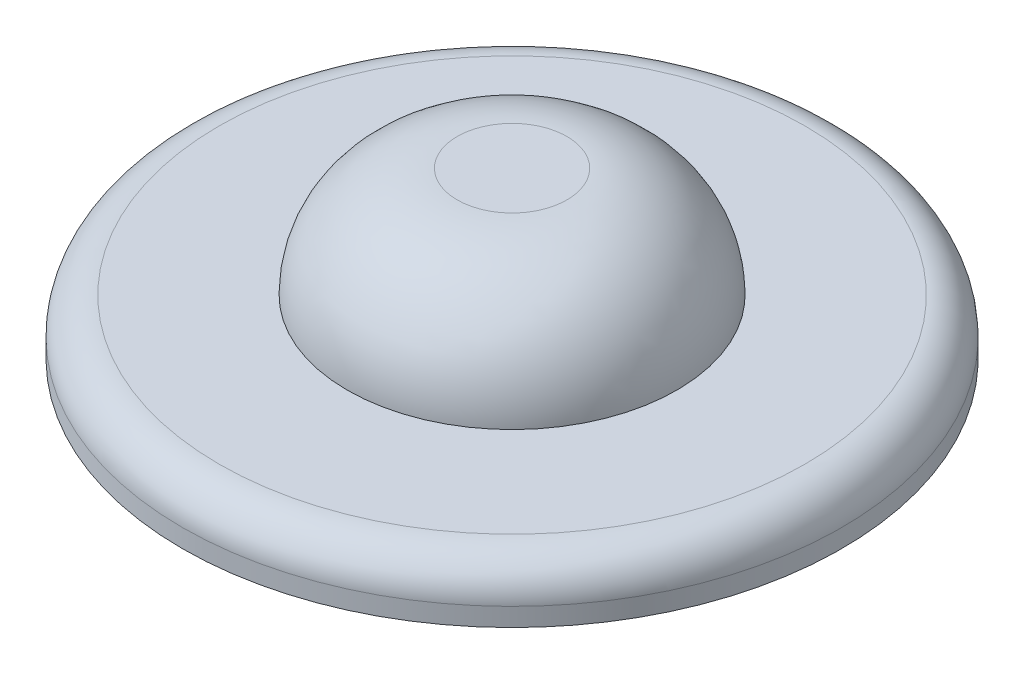
ISO-10303-21;
HEADER;
FILE_DESCRIPTION(('STEP AP214'),'2;1');
FILE_NAME('part.step','',(''),(''),'','','');
FILE_SCHEMA(('AUTOMOTIVE_DESIGN { 1 0 10303 214 1 1 1 1 }'));
ENDSEC;
DATA;
#1=APPLICATION_CONTEXT('core data for automotive mechanical design processes');
#2=APPLICATION_PROTOCOL_DEFINITION('international standard','automotive_design',2000,#1);
#3=PRODUCT_CONTEXT('',#1,'mechanical');
#4=PRODUCT('Part','Part','',(#3));
#5=PRODUCT_RELATED_PRODUCT_CATEGORY('part','',(#4));
#6=PRODUCT_DEFINITION_FORMATION('','',#4);
#7=PRODUCT_DEFINITION_CONTEXT('part definition',#1,'design');
#8=PRODUCT_DEFINITION('design','',#6,#7);
#9=PRODUCT_DEFINITION_SHAPE('','',#8);
#10=(LENGTH_UNIT() NAMED_UNIT(*) SI_UNIT(.MILLI.,.METRE.));
#11=(NAMED_UNIT(*) PLANE_ANGLE_UNIT() SI_UNIT($,.RADIAN.));
#12=(NAMED_UNIT(*) SI_UNIT($,.STERADIAN.) SOLID_ANGLE_UNIT());
#13=UNCERTAINTY_MEASURE_WITH_UNIT(LENGTH_MEASURE(1.E-05),#10,'distance_accuracy_value','');
#14=(GEOMETRIC_REPRESENTATION_CONTEXT(3) GLOBAL_UNCERTAINTY_ASSIGNED_CONTEXT((#13)) GLOBAL_UNIT_ASSIGNED_CONTEXT((#10,
#11,#12)) REPRESENTATION_CONTEXT('',''));
#15=CARTESIAN_POINT('',(0.,0.,0.));
#16=DIRECTION('',(0.,0.,1.));
#17=DIRECTION('',(1.,0.,0.));
#18=AXIS2_PLACEMENT_3D('',#15,#16,#17);
#19=CARTESIAN_POINT('',(0.,10.,0.));
#20=DIRECTION('',(0.,-1.,0.));
#21=DIRECTION('',(0.,0.,-1.));
#22=AXIS2_PLACEMENT_3D('',#19,#20,#21);
#23=CYLINDRICAL_SURFACE('',#22,60.);
#24=CARTESIAN_POINT('',(0.,10.,0.));
#25=DIRECTION('',(0.,1.,0.));
#26=DIRECTION('',(0.,0.,1.));
#27=AXIS2_PLACEMENT_3D('',#24,#25,#26);
#28=CIRCLE('',#27,60.);
#29=CARTESIAN_POINT('',(0.,10.,60.));
#30=VERTEX_POINT('',#29);
#31=EDGE_CURVE('E75',#30,#30,#28,.T.);
#32=ORIENTED_EDGE('',*,*,#31,.F.);
#33=EDGE_LOOP('',(#32));
#34=FACE_BOUND('',#33,.T.);
#35=CARTESIAN_POINT('',(0.,0.,0.));
#36=DIRECTION('',(0.,1.,0.));
#37=DIRECTION('',(0.,0.,1.));
#38=AXIS2_PLACEMENT_3D('',#35,#36,#37);
#39=CIRCLE('',#38,60.);
#40=CARTESIAN_POINT('',(0.,0.,60.));
#41=VERTEX_POINT('',#40);
#42=EDGE_CURVE('E71',#41,#41,#39,.T.);
#43=ORIENTED_EDGE('',*,*,#42,.T.);
#44=EDGE_LOOP('',(#43));
#45=FACE_BOUND('',#44,.T.);
#46=ADVANCED_FACE('F48',(#34,#45),#23,.T.);
#47=CARTESIAN_POINT('',(0.,0.,0.));
#48=DIRECTION('',(0.,1.,0.));
#49=DIRECTION('',(0.,0.,1.));
#50=AXIS2_PLACEMENT_3D('',#47,#48,#49);
#51=PLANE('',#50);
#52=ORIENTED_EDGE('',*,*,#42,.F.);
#53=EDGE_LOOP('',(#52));
#54=FACE_BOUND('',#53,.T.);
#55=ADVANCED_FACE('F103',(#54),#51,.F.);
#56=CARTESIAN_POINT('',(0.,25.,0.));
#57=DIRECTION('',(0.,-1.,0.));
#58=DIRECTION('',(0.,0.,-1.));
#59=AXIS2_PLACEMENT_3D('',#56,#57,#58);
#60=CYLINDRICAL_SURFACE('',#59,90.);
#61=CARTESIAN_POINT('',(0.,15.,0.));
#62=DIRECTION('',(0.,1.,0.));
#63=DIRECTION('',(0.,0.,1.));
#64=AXIS2_PLACEMENT_3D('',#61,#62,#63);
#65=CIRCLE('',#64,90.);
#66=CARTESIAN_POINT('',(0.,15.,90.));
#67=VERTEX_POINT('',#66);
#68=EDGE_CURVE('E56',#67,#67,#65,.F.);
#69=ORIENTED_EDGE('',*,*,#68,.T.);
#70=EDGE_LOOP('',(#69));
#71=FACE_BOUND('',#70,.T.);
#72=CARTESIAN_POINT('',(0.,10.,0.));
#73=DIRECTION('',(0.,1.,0.));
#74=DIRECTION('',(0.,0.,1.));
#75=AXIS2_PLACEMENT_3D('',#72,#73,#74);
#76=CIRCLE('',#75,90.);
#77=CARTESIAN_POINT('',(0.,10.,90.));
#78=VERTEX_POINT('',#77);
#79=EDGE_CURVE('E76',#78,#78,#76,.T.);
#80=ORIENTED_EDGE('',*,*,#79,.T.);
#81=EDGE_LOOP('',(#80));
#82=FACE_BOUND('',#81,.T.);
#83=ADVANCED_FACE('F93',(#71,#82),#60,.T.);
#84=CARTESIAN_POINT('',(0.,25.,0.));
#85=DIRECTION('',(0.,1.,0.));
#86=DIRECTION('',(0.,0.,1.));
#87=AXIS2_PLACEMENT_3D('',#84,#85,#86);
#88=PLANE('',#87);
#89=CARTESIAN_POINT('',(0.,25.,0.));
#90=DIRECTION('',(0.,1.,0.));
#91=DIRECTION('',(0.,0.,1.));
#92=AXIS2_PLACEMENT_3D('',#89,#90,#91);
#93=CIRCLE('',#92,80.);
#94=CARTESIAN_POINT('',(0.,25.,80.));
#95=VERTEX_POINT('',#94);
#96=EDGE_CURVE('E62',#95,#95,#93,.T.);
#97=ORIENTED_EDGE('',*,*,#96,.T.);
#98=EDGE_LOOP('',(#97));
#99=FACE_BOUND('',#98,.T.);
#100=CARTESIAN_POINT('',(0.,25.,0.));
#101=DIRECTION('',(0.,1.,0.));
#102=DIRECTION('',(0.,0.,1.));
#103=AXIS2_PLACEMENT_3D('',#100,#101,#102);
#104=CIRCLE('',#103,45.);
#105=CARTESIAN_POINT('',(0.,25.,45.));
#106=VERTEX_POINT('',#105);
#107=EDGE_CURVE('E68',#106,#106,#104,.T.);
#108=ORIENTED_EDGE('',*,*,#107,.F.);
#109=EDGE_LOOP('',(#108));
#110=FACE_BOUND('',#109,.T.);
#111=ADVANCED_FACE('F90',(#99,#110),#88,.T.);
#112=CARTESIAN_POINT('',(0.,10.,0.));
#113=DIRECTION('',(0.,1.,0.));
#114=DIRECTION('',(0.,0.,1.));
#115=AXIS2_PLACEMENT_3D('',#112,#113,#114);
#116=PLANE('',#115);
#117=ORIENTED_EDGE('',*,*,#31,.T.);
#118=EDGE_LOOP('',(#117));
#119=FACE_BOUND('',#118,.T.);
#120=ORIENTED_EDGE('',*,*,#79,.F.);
#121=EDGE_LOOP('',(#120));
#122=FACE_BOUND('',#121,.T.);
#123=ADVANCED_FACE('F92',(#119,#122),#116,.F.);
#124=CARTESIAN_POINT('',(0.,55.,0.));
#125=DIRECTION('',(0.,1.,0.));
#126=DIRECTION('',(0.,0.,1.));
#127=AXIS2_PLACEMENT_3D('',#124,#125,#126);
#128=PLANE('',#127);
#129=CARTESIAN_POINT('',(0.,55.,0.));
#130=DIRECTION('',(0.,1.,0.));
#131=DIRECTION('',(0.,0.,1.));
#132=AXIS2_PLACEMENT_3D('',#129,#130,#131);
#133=CIRCLE('',#132,15.);
#134=CARTESIAN_POINT('',(0.,55.,15.));
#135=VERTEX_POINT('',#134);
#136=EDGE_CURVE('E12',#135,#135,#133,.T.);
#137=ORIENTED_EDGE('',*,*,#136,.T.);
#138=EDGE_LOOP('',(#137));
#139=FACE_BOUND('',#138,.T.);
#140=ADVANCED_FACE('F100',(#139),#128,.T.);
#141=CARTESIAN_POINT('',(0.,15.,0.));
#142=DIRECTION('',(0.,1.,0.));
#143=DIRECTION('',(0.,0.,1.));
#144=AXIS2_PLACEMENT_3D('',#141,#142,#143);
#145=TOROIDAL_SURFACE('',#144,80.,10.);
#146=ORIENTED_EDGE('',*,*,#68,.F.);
#147=EDGE_LOOP('',(#146));
#148=FACE_BOUND('',#147,.T.);
#149=ORIENTED_EDGE('',*,*,#96,.F.);
#150=EDGE_LOOP('',(#149));
#151=FACE_BOUND('',#150,.T.);
#152=ADVANCED_FACE('F116',(#148,#151),#145,.T.);
#153=CARTESIAN_POINT('',(0.,25.,0.));
#154=DIRECTION('',(0.,1.,0.));
#155=DIRECTION('',(0.,0.,1.));
#156=AXIS2_PLACEMENT_3D('',#153,#154,#155);
#157=DEGENERATE_TOROIDAL_SURFACE('',#156,15.,30.,.T.);
#158=ORIENTED_EDGE('',*,*,#107,.T.);
#159=EDGE_LOOP('',(#158));
#160=FACE_BOUND('',#159,.T.);
#161=ORIENTED_EDGE('',*,*,#136,.F.);
#162=EDGE_LOOP('',(#161));
#163=FACE_BOUND('',#162,.T.);
#164=ADVANCED_FACE('F50',(#160,#163),#157,.T.);
#165=CLOSED_SHELL('',(#46,#55,#83,#111,#123,#140,#152,#164));
#166=MANIFOLD_SOLID_BREP('B2',#165);
#167=ADVANCED_BREP_SHAPE_REPRESENTATION('',(#18,#166),#14);
#168=SHAPE_DEFINITION_REPRESENTATION(#9,#167);
ENDSEC;
END-ISO-10303-21;
